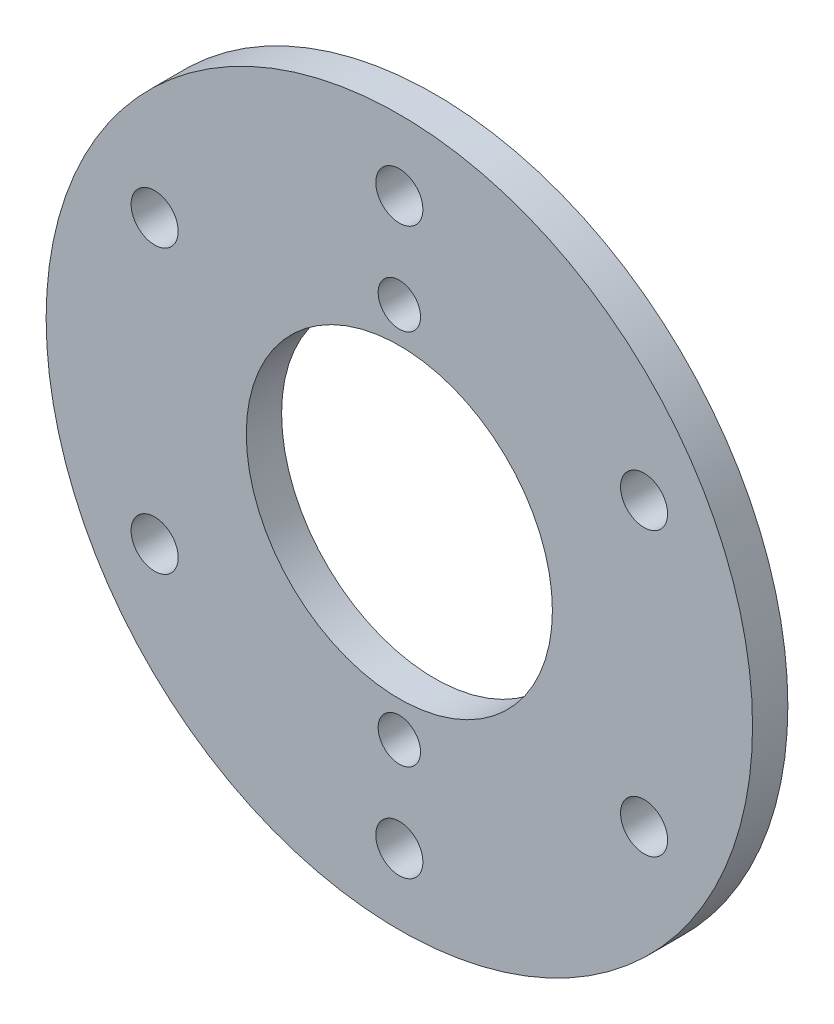
ISO-10303-21;
HEADER;
FILE_DESCRIPTION(('STEP AP214'),'2;1');
FILE_NAME('part.step','',(''),(''),'','','');
FILE_SCHEMA(('AUTOMOTIVE_DESIGN { 1 0 10303 214 1 1 1 1 }'));
ENDSEC;
DATA;
#1=APPLICATION_CONTEXT('core data for automotive mechanical design processes');
#2=APPLICATION_PROTOCOL_DEFINITION('international standard','automotive_design',2000,#1);
#3=PRODUCT_CONTEXT('',#1,'mechanical');
#4=PRODUCT('Part','Part','',(#3));
#5=PRODUCT_RELATED_PRODUCT_CATEGORY('part','',(#4));
#6=PRODUCT_DEFINITION_FORMATION('','',#4);
#7=PRODUCT_DEFINITION_CONTEXT('part definition',#1,'design');
#8=PRODUCT_DEFINITION('design','',#6,#7);
#9=PRODUCT_DEFINITION_SHAPE('','',#8);
#10=(LENGTH_UNIT() NAMED_UNIT(*) SI_UNIT(.MILLI.,.METRE.));
#11=(NAMED_UNIT(*) PLANE_ANGLE_UNIT() SI_UNIT($,.RADIAN.));
#12=(NAMED_UNIT(*) SI_UNIT($,.STERADIAN.) SOLID_ANGLE_UNIT());
#13=UNCERTAINTY_MEASURE_WITH_UNIT(LENGTH_MEASURE(1.E-05),#10,'distance_accuracy_value','');
#14=(GEOMETRIC_REPRESENTATION_CONTEXT(3) GLOBAL_UNCERTAINTY_ASSIGNED_CONTEXT((#13)) GLOBAL_UNIT_ASSIGNED_CONTEXT((#10,
#11,#12)) REPRESENTATION_CONTEXT('',''));
#15=CARTESIAN_POINT('',(0.,0.,0.));
#16=DIRECTION('',(0.,0.,1.));
#17=DIRECTION('',(1.,0.,0.));
#18=AXIS2_PLACEMENT_3D('',#15,#16,#17);
#19=CARTESIAN_POINT('',(0.,0.,15.));
#20=DIRECTION('',(0.,0.,1.));
#21=DIRECTION('',(1.,0.,0.));
#22=AXIS2_PLACEMENT_3D('',#19,#20,#21);
#23=PLANE('',#22);
#24=CARTESIAN_POINT('',(0.,80.,15.));
#25=DIRECTION('',(0.,0.,1.));
#26=DIRECTION('',(1.,0.,0.));
#27=AXIS2_PLACEMENT_3D('',#24,#25,#26);
#28=CIRCLE('',#27,9.);
#29=CARTESIAN_POINT('',(9.,80.,15.));
#30=VERTEX_POINT('',#29);
#31=EDGE_CURVE('E125',#30,#30,#28,.T.);
#32=ORIENTED_EDGE('',*,*,#31,.F.);
#33=EDGE_LOOP('',(#32));
#34=FACE_BOUND('',#33,.T.);
#35=CARTESIAN_POINT('',(0.,-80.,15.));
#36=DIRECTION('',(0.,0.,1.));
#37=DIRECTION('',(1.,0.,0.));
#38=AXIS2_PLACEMENT_3D('',#35,#36,#37);
#39=CIRCLE('',#38,9.);
#40=CARTESIAN_POINT('',(9.,-80.,15.));
#41=VERTEX_POINT('',#40);
#42=EDGE_CURVE('E117',#41,#41,#39,.T.);
#43=ORIENTED_EDGE('',*,*,#42,.F.);
#44=EDGE_LOOP('',(#43));
#45=FACE_BOUND('',#44,.T.);
#46=CARTESIAN_POINT('',(103.923048454132,60.0000000000012,15.));
#47=DIRECTION('',(0.,0.,1.));
#48=DIRECTION('',(1.,0.,0.));
#49=AXIS2_PLACEMENT_3D('',#46,#47,#48);
#50=CIRCLE('',#49,9.99999999999999);
#51=CARTESIAN_POINT('',(113.923048454132,60.0000000000012,15.));
#52=VERTEX_POINT('',#51);
#53=EDGE_CURVE('E109',#52,#52,#50,.T.);
#54=ORIENTED_EDGE('',*,*,#53,.F.);
#55=EDGE_LOOP('',(#54));
#56=FACE_BOUND('',#55,.T.);
#57=CARTESIAN_POINT('',(103.923048454133,-59.999999999999,15.));
#58=DIRECTION('',(0.,0.,1.));
#59=DIRECTION('',(1.,0.,0.));
#60=AXIS2_PLACEMENT_3D('',#57,#58,#59);
#61=CIRCLE('',#60,9.99999999999998);
#62=CARTESIAN_POINT('',(113.923048454133,-59.999999999999,15.));
#63=VERTEX_POINT('',#62);
#64=EDGE_CURVE('E101',#63,#63,#61,.T.);
#65=ORIENTED_EDGE('',*,*,#64,.F.);
#66=EDGE_LOOP('',(#65));
#67=FACE_BOUND('',#66,.T.);
#68=CARTESIAN_POINT('',(0.,-120.,15.));
#69=DIRECTION('',(0.,0.,1.));
#70=DIRECTION('',(1.,0.,0.));
#71=AXIS2_PLACEMENT_3D('',#68,#69,#70);
#72=CIRCLE('',#71,9.99999999999999);
#73=CARTESIAN_POINT('',(9.99999999999999,-120.,15.));
#74=VERTEX_POINT('',#73);
#75=EDGE_CURVE('E93',#74,#74,#72,.T.);
#76=ORIENTED_EDGE('',*,*,#75,.F.);
#77=EDGE_LOOP('',(#76));
#78=FACE_BOUND('',#77,.T.);
#79=CARTESIAN_POINT('',(-103.923048454132,-60.0000000000005,15.));
#80=DIRECTION('',(0.,0.,1.));
#81=DIRECTION('',(1.,0.,0.));
#82=AXIS2_PLACEMENT_3D('',#79,#80,#81);
#83=CIRCLE('',#82,9.99999999999999);
#84=CARTESIAN_POINT('',(-93.9230484541324,-60.0000000000005,15.));
#85=VERTEX_POINT('',#84);
#86=EDGE_CURVE('E85',#85,#85,#83,.T.);
#87=ORIENTED_EDGE('',*,*,#86,.F.);
#88=EDGE_LOOP('',(#87));
#89=FACE_BOUND('',#88,.T.);
#90=CARTESIAN_POINT('',(-103.923048454133,59.9999999999998,15.));
#91=DIRECTION('',(0.,0.,1.));
#92=DIRECTION('',(1.,0.,0.));
#93=AXIS2_PLACEMENT_3D('',#90,#91,#92);
#94=CIRCLE('',#93,9.99999999999998);
#95=CARTESIAN_POINT('',(-93.9230484541328,59.9999999999998,15.));
#96=VERTEX_POINT('',#95);
#97=EDGE_CURVE('E77',#96,#96,#94,.T.);
#98=ORIENTED_EDGE('',*,*,#97,.F.);
#99=EDGE_LOOP('',(#98));
#100=FACE_BOUND('',#99,.T.);
#101=CARTESIAN_POINT('',(0.,120.,15.));
#102=DIRECTION('',(0.,0.,1.));
#103=DIRECTION('',(1.,0.,0.));
#104=AXIS2_PLACEMENT_3D('',#101,#102,#103);
#105=CIRCLE('',#104,9.99999999999999);
#106=CARTESIAN_POINT('',(9.99999999999999,120.,15.));
#107=VERTEX_POINT('',#106);
#108=EDGE_CURVE('E69',#107,#107,#105,.T.);
#109=ORIENTED_EDGE('',*,*,#108,.F.);
#110=EDGE_LOOP('',(#109));
#111=FACE_BOUND('',#110,.T.);
#112=CARTESIAN_POINT('',(0.,0.,15.));
#113=DIRECTION('',(0.,0.,1.));
#114=DIRECTION('',(1.,0.,0.));
#115=AXIS2_PLACEMENT_3D('',#112,#113,#114);
#116=CIRCLE('',#115,150.);
#117=CARTESIAN_POINT('',(150.,0.,15.));
#118=VERTEX_POINT('',#117);
#119=EDGE_CURVE('E10',#118,#118,#116,.T.);
#120=ORIENTED_EDGE('',*,*,#119,.T.);
#121=EDGE_LOOP('',(#120));
#122=FACE_BOUND('',#121,.T.);
#123=CARTESIAN_POINT('',(0.,0.,15.));
#124=DIRECTION('',(0.,0.,1.));
#125=DIRECTION('',(1.,0.,0.));
#126=AXIS2_PLACEMENT_3D('',#123,#124,#125);
#127=CIRCLE('',#126,65.);
#128=CARTESIAN_POINT('',(65.,0.,15.));
#129=VERTEX_POINT('',#128);
#130=EDGE_CURVE('E56',#129,#129,#127,.T.);
#131=ORIENTED_EDGE('',*,*,#130,.F.);
#132=EDGE_LOOP('',(#131));
#133=FACE_BOUND('',#132,.T.);
#134=ADVANCED_FACE('F43',(#34,#45,#56,#67,#78,#89,#100,#111,#122,#133),#23,.T.);
#135=CARTESIAN_POINT('',(0.,0.,0.));
#136=DIRECTION('',(0.,0.,1.));
#137=DIRECTION('',(1.,0.,0.));
#138=AXIS2_PLACEMENT_3D('',#135,#136,#137);
#139=PLANE('',#138);
#140=CARTESIAN_POINT('',(0.,80.,0.));
#141=DIRECTION('',(0.,0.,1.));
#142=DIRECTION('',(1.,0.,0.));
#143=AXIS2_PLACEMENT_3D('',#140,#141,#142);
#144=CIRCLE('',#143,9.);
#145=CARTESIAN_POINT('',(9.,80.,0.));
#146=VERTEX_POINT('',#145);
#147=EDGE_CURVE('E121',#146,#146,#144,.T.);
#148=ORIENTED_EDGE('',*,*,#147,.T.);
#149=EDGE_LOOP('',(#148));
#150=FACE_BOUND('',#149,.T.);
#151=CARTESIAN_POINT('',(0.,-80.,0.));
#152=DIRECTION('',(0.,0.,1.));
#153=DIRECTION('',(1.,0.,0.));
#154=AXIS2_PLACEMENT_3D('',#151,#152,#153);
#155=CIRCLE('',#154,9.);
#156=CARTESIAN_POINT('',(9.,-80.,0.));
#157=VERTEX_POINT('',#156);
#158=EDGE_CURVE('E113',#157,#157,#155,.T.);
#159=ORIENTED_EDGE('',*,*,#158,.T.);
#160=EDGE_LOOP('',(#159));
#161=FACE_BOUND('',#160,.T.);
#162=CARTESIAN_POINT('',(103.923048454132,60.0000000000012,0.));
#163=DIRECTION('',(0.,0.,1.));
#164=DIRECTION('',(1.,0.,0.));
#165=AXIS2_PLACEMENT_3D('',#162,#163,#164);
#166=CIRCLE('',#165,9.99999999999999);
#167=CARTESIAN_POINT('',(113.923048454132,60.0000000000012,0.));
#168=VERTEX_POINT('',#167);
#169=EDGE_CURVE('E105',#168,#168,#166,.T.);
#170=ORIENTED_EDGE('',*,*,#169,.T.);
#171=EDGE_LOOP('',(#170));
#172=FACE_BOUND('',#171,.T.);
#173=CARTESIAN_POINT('',(103.923048454133,-59.999999999999,0.));
#174=DIRECTION('',(0.,0.,1.));
#175=DIRECTION('',(1.,0.,0.));
#176=AXIS2_PLACEMENT_3D('',#173,#174,#175);
#177=CIRCLE('',#176,9.99999999999999);
#178=CARTESIAN_POINT('',(113.923048454133,-59.999999999999,0.));
#179=VERTEX_POINT('',#178);
#180=EDGE_CURVE('E97',#179,#179,#177,.T.);
#181=ORIENTED_EDGE('',*,*,#180,.T.);
#182=EDGE_LOOP('',(#181));
#183=FACE_BOUND('',#182,.T.);
#184=CARTESIAN_POINT('',(0.,-120.,0.));
#185=DIRECTION('',(0.,0.,1.));
#186=DIRECTION('',(1.,0.,0.));
#187=AXIS2_PLACEMENT_3D('',#184,#185,#186);
#188=CIRCLE('',#187,10.);
#189=CARTESIAN_POINT('',(10.,-120.,0.));
#190=VERTEX_POINT('',#189);
#191=EDGE_CURVE('E89',#190,#190,#188,.T.);
#192=ORIENTED_EDGE('',*,*,#191,.T.);
#193=EDGE_LOOP('',(#192));
#194=FACE_BOUND('',#193,.T.);
#195=CARTESIAN_POINT('',(-103.923048454132,-60.0000000000005,0.));
#196=DIRECTION('',(0.,0.,1.));
#197=DIRECTION('',(1.,0.,0.));
#198=AXIS2_PLACEMENT_3D('',#195,#196,#197);
#199=CIRCLE('',#198,9.99999999999999);
#200=CARTESIAN_POINT('',(-93.9230484541324,-60.0000000000005,0.));
#201=VERTEX_POINT('',#200);
#202=EDGE_CURVE('E81',#201,#201,#199,.T.);
#203=ORIENTED_EDGE('',*,*,#202,.T.);
#204=EDGE_LOOP('',(#203));
#205=FACE_BOUND('',#204,.T.);
#206=CARTESIAN_POINT('',(-103.923048454133,59.9999999999998,0.));
#207=DIRECTION('',(0.,0.,1.));
#208=DIRECTION('',(1.,0.,0.));
#209=AXIS2_PLACEMENT_3D('',#206,#207,#208);
#210=CIRCLE('',#209,9.99999999999999);
#211=CARTESIAN_POINT('',(-93.9230484541328,59.9999999999998,0.));
#212=VERTEX_POINT('',#211);
#213=EDGE_CURVE('E73',#212,#212,#210,.T.);
#214=ORIENTED_EDGE('',*,*,#213,.T.);
#215=EDGE_LOOP('',(#214));
#216=FACE_BOUND('',#215,.T.);
#217=CARTESIAN_POINT('',(0.,120.,0.));
#218=DIRECTION('',(0.,0.,1.));
#219=DIRECTION('',(1.,0.,0.));
#220=AXIS2_PLACEMENT_3D('',#217,#218,#219);
#221=CIRCLE('',#220,10.);
#222=CARTESIAN_POINT('',(10.,120.,0.));
#223=VERTEX_POINT('',#222);
#224=EDGE_CURVE('E62',#223,#223,#221,.T.);
#225=ORIENTED_EDGE('',*,*,#224,.T.);
#226=EDGE_LOOP('',(#225));
#227=FACE_BOUND('',#226,.T.);
#228=CARTESIAN_POINT('',(0.,0.,0.));
#229=DIRECTION('',(0.,0.,1.));
#230=DIRECTION('',(1.,0.,0.));
#231=AXIS2_PLACEMENT_3D('',#228,#229,#230);
#232=CIRCLE('',#231,150.);
#233=CARTESIAN_POINT('',(150.,0.,0.));
#234=VERTEX_POINT('',#233);
#235=EDGE_CURVE('E47',#234,#234,#232,.T.);
#236=ORIENTED_EDGE('',*,*,#235,.F.);
#237=EDGE_LOOP('',(#236));
#238=FACE_BOUND('',#237,.T.);
#239=CARTESIAN_POINT('',(0.,0.,0.));
#240=DIRECTION('',(0.,0.,1.));
#241=DIRECTION('',(1.,0.,0.));
#242=AXIS2_PLACEMENT_3D('',#239,#240,#241);
#243=CIRCLE('',#242,65.);
#244=CARTESIAN_POINT('',(65.,0.,0.));
#245=VERTEX_POINT('',#244);
#246=EDGE_CURVE('E58',#245,#245,#243,.T.);
#247=ORIENTED_EDGE('',*,*,#246,.T.);
#248=EDGE_LOOP('',(#247));
#249=FACE_BOUND('',#248,.T.);
#250=ADVANCED_FACE('F134',(#150,#161,#172,#183,#194,#205,#216,#227,#238,#249),#139,.F.);
#251=CARTESIAN_POINT('',(0.,0.,15.));
#252=DIRECTION('',(0.,0.,-1.));
#253=DIRECTION('',(-1.,0.,0.));
#254=AXIS2_PLACEMENT_3D('',#251,#252,#253);
#255=CYLINDRICAL_SURFACE('',#254,150.);
#256=ORIENTED_EDGE('',*,*,#119,.F.);
#257=EDGE_LOOP('',(#256));
#258=FACE_BOUND('',#257,.T.);
#259=ORIENTED_EDGE('',*,*,#235,.T.);
#260=EDGE_LOOP('',(#259));
#261=FACE_BOUND('',#260,.T.);
#262=ADVANCED_FACE('F45',(#258,#261),#255,.T.);
#263=CARTESIAN_POINT('',(0.,0.,15.));
#264=DIRECTION('',(0.,0.,-1.));
#265=DIRECTION('',(-1.,0.,0.));
#266=AXIS2_PLACEMENT_3D('',#263,#264,#265);
#267=CYLINDRICAL_SURFACE('',#266,65.);
#268=ORIENTED_EDGE('',*,*,#130,.T.);
#269=EDGE_LOOP('',(#268));
#270=FACE_BOUND('',#269,.T.);
#271=ORIENTED_EDGE('',*,*,#246,.F.);
#272=EDGE_LOOP('',(#271));
#273=FACE_BOUND('',#272,.T.);
#274=ADVANCED_FACE('F152',(#270,#273),#267,.F.);
#275=CARTESIAN_POINT('',(0.,120.,15.));
#276=DIRECTION('',(0.,0.,1.));
#277=DIRECTION('',(1.,0.,0.));
#278=AXIS2_PLACEMENT_3D('',#275,#276,#277);
#279=CYLINDRICAL_SURFACE('',#278,9.99999999999999);
#280=ORIENTED_EDGE('',*,*,#224,.F.);
#281=EDGE_LOOP('',(#280));
#282=FACE_BOUND('',#281,.T.);
#283=ORIENTED_EDGE('',*,*,#108,.T.);
#284=EDGE_LOOP('',(#283));
#285=FACE_BOUND('',#284,.T.);
#286=ADVANCED_FACE('F155',(#282,#285),#279,.F.);
#287=CARTESIAN_POINT('',(-103.923048454133,59.9999999999998,15.));
#288=DIRECTION('',(0.,0.,1.));
#289=DIRECTION('',(1.,0.,0.));
#290=AXIS2_PLACEMENT_3D('',#287,#288,#289);
#291=CYLINDRICAL_SURFACE('',#290,9.99999999999999);
#292=ORIENTED_EDGE('',*,*,#213,.F.);
#293=EDGE_LOOP('',(#292));
#294=FACE_BOUND('',#293,.T.);
#295=ORIENTED_EDGE('',*,*,#97,.T.);
#296=EDGE_LOOP('',(#295));
#297=FACE_BOUND('',#296,.T.);
#298=ADVANCED_FACE('F170',(#294,#297),#291,.F.);
#299=CARTESIAN_POINT('',(-103.923048454132,-60.0000000000005,15.));
#300=DIRECTION('',(0.,0.,1.));
#301=DIRECTION('',(1.,0.,0.));
#302=AXIS2_PLACEMENT_3D('',#299,#300,#301);
#303=CYLINDRICAL_SURFACE('',#302,9.99999999999999);
#304=ORIENTED_EDGE('',*,*,#202,.F.);
#305=EDGE_LOOP('',(#304));
#306=FACE_BOUND('',#305,.T.);
#307=ORIENTED_EDGE('',*,*,#86,.T.);
#308=EDGE_LOOP('',(#307));
#309=FACE_BOUND('',#308,.T.);
#310=ADVANCED_FACE('F174',(#306,#309),#303,.F.);
#311=CARTESIAN_POINT('',(0.,-120.,15.));
#312=DIRECTION('',(0.,0.,1.));
#313=DIRECTION('',(1.,0.,0.));
#314=AXIS2_PLACEMENT_3D('',#311,#312,#313);
#315=CYLINDRICAL_SURFACE('',#314,9.99999999999999);
#316=ORIENTED_EDGE('',*,*,#191,.F.);
#317=EDGE_LOOP('',(#316));
#318=FACE_BOUND('',#317,.T.);
#319=ORIENTED_EDGE('',*,*,#75,.T.);
#320=EDGE_LOOP('',(#319));
#321=FACE_BOUND('',#320,.T.);
#322=ADVANCED_FACE('F178',(#318,#321),#315,.F.);
#323=CARTESIAN_POINT('',(103.923048454133,-59.999999999999,15.));
#324=DIRECTION('',(0.,0.,1.));
#325=DIRECTION('',(1.,0.,0.));
#326=AXIS2_PLACEMENT_3D('',#323,#324,#325);
#327=CYLINDRICAL_SURFACE('',#326,9.99999999999999);
#328=ORIENTED_EDGE('',*,*,#180,.F.);
#329=EDGE_LOOP('',(#328));
#330=FACE_BOUND('',#329,.T.);
#331=ORIENTED_EDGE('',*,*,#64,.T.);
#332=EDGE_LOOP('',(#331));
#333=FACE_BOUND('',#332,.T.);
#334=ADVANCED_FACE('F182',(#330,#333),#327,.F.);
#335=CARTESIAN_POINT('',(103.923048454132,60.0000000000012,15.));
#336=DIRECTION('',(0.,0.,1.));
#337=DIRECTION('',(1.,0.,0.));
#338=AXIS2_PLACEMENT_3D('',#335,#336,#337);
#339=CYLINDRICAL_SURFACE('',#338,9.99999999999999);
#340=ORIENTED_EDGE('',*,*,#169,.F.);
#341=EDGE_LOOP('',(#340));
#342=FACE_BOUND('',#341,.T.);
#343=ORIENTED_EDGE('',*,*,#53,.T.);
#344=EDGE_LOOP('',(#343));
#345=FACE_BOUND('',#344,.T.);
#346=ADVANCED_FACE('F186',(#342,#345),#339,.F.);
#347=CARTESIAN_POINT('',(0.,-80.,15.));
#348=DIRECTION('',(0.,0.,1.));
#349=DIRECTION('',(1.,0.,0.));
#350=AXIS2_PLACEMENT_3D('',#347,#348,#349);
#351=CYLINDRICAL_SURFACE('',#350,9.);
#352=ORIENTED_EDGE('',*,*,#158,.F.);
#353=EDGE_LOOP('',(#352));
#354=FACE_BOUND('',#353,.T.);
#355=ORIENTED_EDGE('',*,*,#42,.T.);
#356=EDGE_LOOP('',(#355));
#357=FACE_BOUND('',#356,.T.);
#358=ADVANCED_FACE('F190',(#354,#357),#351,.F.);
#359=CARTESIAN_POINT('',(0.,80.,15.));
#360=DIRECTION('',(0.,0.,1.));
#361=DIRECTION('',(1.,0.,0.));
#362=AXIS2_PLACEMENT_3D('',#359,#360,#361);
#363=CYLINDRICAL_SURFACE('',#362,9.);
#364=ORIENTED_EDGE('',*,*,#147,.F.);
#365=EDGE_LOOP('',(#364));
#366=FACE_BOUND('',#365,.T.);
#367=ORIENTED_EDGE('',*,*,#31,.T.);
#368=EDGE_LOOP('',(#367));
#369=FACE_BOUND('',#368,.T.);
#370=ADVANCED_FACE('F130',(#366,#369),#363,.F.);
#371=CLOSED_SHELL('',(#134,#250,#262,#274,#286,#298,#310,#322,#334,#346,#358,#370));
#372=MANIFOLD_SOLID_BREP('B2',#371);
#373=ADVANCED_BREP_SHAPE_REPRESENTATION('',(#18,#372),#14);
#374=SHAPE_DEFINITION_REPRESENTATION(#9,#373);
ENDSEC;
END-ISO-10303-21;
